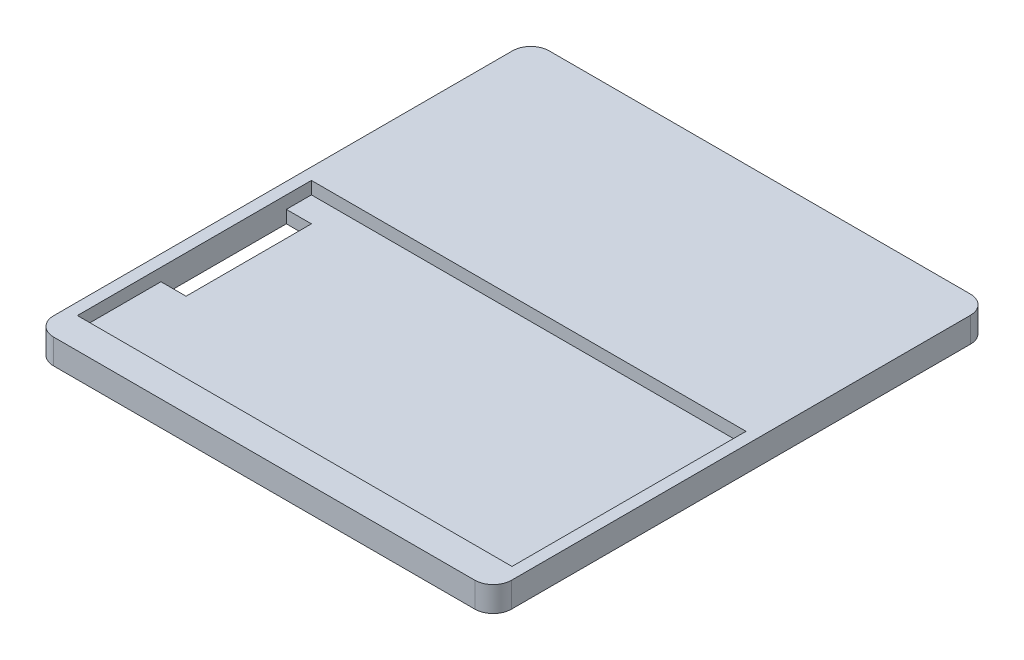
ISO-10303-21;
HEADER;
FILE_DESCRIPTION(('STEP AP214'),'2;1');
FILE_NAME('part.step','',(''),(''),'','','');
FILE_SCHEMA(('AUTOMOTIVE_DESIGN { 1 0 10303 214 1 1 1 1 }'));
ENDSEC;
DATA;
#1=APPLICATION_CONTEXT('core data for automotive mechanical design processes');
#2=APPLICATION_PROTOCOL_DEFINITION('international standard','automotive_design',2000,#1);
#3=PRODUCT_CONTEXT('',#1,'mechanical');
#4=PRODUCT('Part','Part','',(#3));
#5=PRODUCT_RELATED_PRODUCT_CATEGORY('part','',(#4));
#6=PRODUCT_DEFINITION_FORMATION('','',#4);
#7=PRODUCT_DEFINITION_CONTEXT('part definition',#1,'design');
#8=PRODUCT_DEFINITION('design','',#6,#7);
#9=PRODUCT_DEFINITION_SHAPE('','',#8);
#10=(LENGTH_UNIT() NAMED_UNIT(*) SI_UNIT(.MILLI.,.METRE.));
#11=(NAMED_UNIT(*) PLANE_ANGLE_UNIT() SI_UNIT($,.RADIAN.));
#12=(NAMED_UNIT(*) SI_UNIT($,.STERADIAN.) SOLID_ANGLE_UNIT());
#13=UNCERTAINTY_MEASURE_WITH_UNIT(LENGTH_MEASURE(1.E-05),#10,'distance_accuracy_value','');
#14=(GEOMETRIC_REPRESENTATION_CONTEXT(3) GLOBAL_UNCERTAINTY_ASSIGNED_CONTEXT((#13)) GLOBAL_UNIT_ASSIGNED_CONTEXT((#10,
#11,#12)) REPRESENTATION_CONTEXT('',''));
#15=CARTESIAN_POINT('',(0.,0.,0.));
#16=DIRECTION('',(0.,0.,1.));
#17=DIRECTION('',(1.,0.,0.));
#18=AXIS2_PLACEMENT_3D('',#15,#16,#17);
#19=CARTESIAN_POINT('',(0.,3.,0.));
#20=DIRECTION('',(0.,-1.,0.));
#21=DIRECTION('',(0.,0.,-1.));
#22=AXIS2_PLACEMENT_3D('',#19,#20,#21);
#23=PLANE('',#22);
#24=DIRECTION('',(1.,0.,0.));
#25=VECTOR('',#24,1.);
#26=CARTESIAN_POINT('',(-27.4,3.,29.65));
#27=LINE('',#26,#25);
#28=CARTESIAN_POINT('',(-25.2,3.,29.65));
#29=VERTEX_POINT('',#28);
#30=CARTESIAN_POINT('',(25.2,3.,29.65));
#31=VERTEX_POINT('',#30);
#32=EDGE_CURVE('E183',#29,#31,#27,.T.);
#33=ORIENTED_EDGE('',*,*,#32,.T.);
#34=CARTESIAN_POINT('',(25.2,3.,27.45));
#35=DIRECTION('',(0.,-1.,0.));
#36=DIRECTION('',(0.,0.,-1.));
#37=AXIS2_PLACEMENT_3D('',#34,#35,#36);
#38=CIRCLE('',#37,2.2);
#39=CARTESIAN_POINT('',(27.4,3.,27.45));
#40=VERTEX_POINT('',#39);
#41=EDGE_CURVE('E221',#31,#40,#38,.F.);
#42=ORIENTED_EDGE('',*,*,#41,.T.);
#43=DIRECTION('',(0.,0.,-1.));
#44=VECTOR('',#43,1.);
#45=CARTESIAN_POINT('',(27.4,3.,29.65));
#46=LINE('',#45,#44);
#47=CARTESIAN_POINT('',(27.4,3.,-27.45));
#48=VERTEX_POINT('',#47);
#49=EDGE_CURVE('E173',#40,#48,#46,.T.);
#50=ORIENTED_EDGE('',*,*,#49,.T.);
#51=CARTESIAN_POINT('',(25.2,3.,-27.45));
#52=DIRECTION('',(0.,-1.,0.));
#53=DIRECTION('',(0.,0.,-1.));
#54=AXIS2_PLACEMENT_3D('',#51,#52,#53);
#55=CIRCLE('',#54,2.2);
#56=CARTESIAN_POINT('',(25.2,3.,-29.65));
#57=VERTEX_POINT('',#56);
#58=EDGE_CURVE('E215',#48,#57,#55,.F.);
#59=ORIENTED_EDGE('',*,*,#58,.T.);
#60=DIRECTION('',(-1.,0.,0.));
#61=VECTOR('',#60,1.);
#62=CARTESIAN_POINT('',(-27.4,3.,-29.65));
#63=LINE('',#62,#61);
#64=CARTESIAN_POINT('',(-25.2,3.,-29.65));
#65=VERTEX_POINT('',#64);
#66=EDGE_CURVE('E176',#57,#65,#63,.T.);
#67=ORIENTED_EDGE('',*,*,#66,.T.);
#68=CARTESIAN_POINT('',(-25.2,3.,-27.45));
#69=DIRECTION('',(0.,-1.,0.));
#70=DIRECTION('',(0.,0.,-1.));
#71=AXIS2_PLACEMENT_3D('',#68,#69,#70);
#72=CIRCLE('',#71,2.2);
#73=CARTESIAN_POINT('',(-27.4,3.,-27.45));
#74=VERTEX_POINT('',#73);
#75=EDGE_CURVE('E217',#65,#74,#72,.F.);
#76=ORIENTED_EDGE('',*,*,#75,.T.);
#77=DIRECTION('',(0.,0.,1.));
#78=VECTOR('',#77,1.);
#79=CARTESIAN_POINT('',(-27.4,3.,29.65));
#80=LINE('',#79,#78);
#81=CARTESIAN_POINT('',(-27.4,3.,27.45));
#82=VERTEX_POINT('',#81);
#83=EDGE_CURVE('E180',#74,#82,#80,.T.);
#84=ORIENTED_EDGE('',*,*,#83,.T.);
#85=CARTESIAN_POINT('',(-25.2,3.,27.45));
#86=DIRECTION('',(0.,-1.,0.));
#87=DIRECTION('',(0.,0.,-1.));
#88=AXIS2_PLACEMENT_3D('',#85,#86,#87);
#89=CIRCLE('',#88,2.2);
#90=EDGE_CURVE('E219',#82,#29,#89,.F.);
#91=ORIENTED_EDGE('',*,*,#90,.T.);
#92=EDGE_LOOP('',(#33,#42,#50,#59,#67,#76,#84,#91));
#93=FACE_BOUND('',#92,.T.);
#94=DIRECTION('',(0.,0.,-1.));
#95=VECTOR('',#94,1.);
#96=CARTESIAN_POINT('',(-26.,3.,0.));
#97=LINE('',#96,#95);
#98=CARTESIAN_POINT('',(-26.,3.,26.));
#99=VERTEX_POINT('',#98);
#100=CARTESIAN_POINT('',(-26.,3.,-2.));
#101=VERTEX_POINT('',#100);
#102=EDGE_CURVE('E415',#99,#101,#97,.T.);
#103=ORIENTED_EDGE('',*,*,#102,.T.);
#104=DIRECTION('',(1.,0.,0.));
#105=VECTOR('',#104,1.);
#106=CARTESIAN_POINT('',(0.,3.,-2.));
#107=LINE('',#106,#105);
#108=CARTESIAN_POINT('',(26.,3.,-2.));
#109=VERTEX_POINT('',#108);
#110=EDGE_CURVE('E149',#101,#109,#107,.T.);
#111=ORIENTED_EDGE('',*,*,#110,.T.);
#112=DIRECTION('',(0.,0.,-1.));
#113=VECTOR('',#112,1.);
#114=CARTESIAN_POINT('',(26.,3.,0.));
#115=LINE('',#114,#113);
#116=CARTESIAN_POINT('',(26.,3.,26.));
#117=VERTEX_POINT('',#116);
#118=EDGE_CURVE('E402',#117,#109,#115,.T.);
#119=ORIENTED_EDGE('',*,*,#118,.F.);
#120=DIRECTION('',(1.,0.,0.));
#121=VECTOR('',#120,1.);
#122=CARTESIAN_POINT('',(0.,3.,26.));
#123=LINE('',#122,#121);
#124=EDGE_CURVE('E396',#99,#117,#123,.T.);
#125=ORIENTED_EDGE('',*,*,#124,.F.);
#126=EDGE_LOOP('',(#103,#111,#119,#125));
#127=FACE_BOUND('',#126,.T.);
#128=ADVANCED_FACE('F33',(#93,#127),#23,.F.);
#129=CARTESIAN_POINT('',(-23.,0.,0.));
#130=DIRECTION('',(-1.,0.,0.));
#131=DIRECTION('',(0.,0.,1.));
#132=AXIS2_PLACEMENT_3D('',#129,#130,#131);
#133=PLANE('',#132);
#134=DIRECTION('',(0.,1.,0.));
#135=VECTOR('',#134,1.);
#136=CARTESIAN_POINT('',(-23.,0.,16.));
#137=LINE('',#136,#135);
#138=CARTESIAN_POINT('',(-23.,0.,16.));
#139=VERTEX_POINT('',#138);
#140=CARTESIAN_POINT('',(-23.,1.5,16.));
#141=VERTEX_POINT('',#140);
#142=EDGE_CURVE('E158',#139,#141,#137,.T.);
#143=ORIENTED_EDGE('',*,*,#142,.T.);
#144=DIRECTION('',(0.,0.,1.));
#145=VECTOR('',#144,1.);
#146=CARTESIAN_POINT('',(-23.,1.5,0.));
#147=LINE('',#146,#145);
#148=CARTESIAN_POINT('',(-23.,1.5,1.));
#149=VERTEX_POINT('',#148);
#150=EDGE_CURVE('E146',#149,#141,#147,.T.);
#151=ORIENTED_EDGE('',*,*,#150,.F.);
#152=DIRECTION('',(0.,1.,0.));
#153=VECTOR('',#152,1.);
#154=CARTESIAN_POINT('',(-23.,0.,1.));
#155=LINE('',#154,#153);
#156=CARTESIAN_POINT('',(-23.,0.,1.));
#157=VERTEX_POINT('',#156);
#158=EDGE_CURVE('E155',#157,#149,#155,.T.);
#159=ORIENTED_EDGE('',*,*,#158,.F.);
#160=DIRECTION('',(0.,0.,1.));
#161=VECTOR('',#160,1.);
#162=CARTESIAN_POINT('',(-23.,0.,0.));
#163=LINE('',#162,#161);
#164=EDGE_CURVE('E420',#157,#139,#163,.T.);
#165=ORIENTED_EDGE('',*,*,#164,.T.);
#166=EDGE_LOOP('',(#143,#151,#159,#165));
#167=FACE_BOUND('',#166,.T.);
#168=ADVANCED_FACE('F154',(#167),#133,.T.);
#169=CARTESIAN_POINT('',(0.,0.,16.));
#170=DIRECTION('',(0.,0.,1.));
#171=DIRECTION('',(1.,0.,0.));
#172=AXIS2_PLACEMENT_3D('',#169,#170,#171);
#173=PLANE('',#172);
#174=DIRECTION('',(1.,0.,0.));
#175=VECTOR('',#174,1.);
#176=CARTESIAN_POINT('',(0.,1.5,16.));
#177=LINE('',#176,#175);
#178=CARTESIAN_POINT('',(-26.,1.5,16.));
#179=VERTEX_POINT('',#178);
#180=EDGE_CURVE('E159',#179,#141,#177,.T.);
#181=ORIENTED_EDGE('',*,*,#180,.T.);
#182=ORIENTED_EDGE('',*,*,#142,.F.);
#183=DIRECTION('',(1.,0.,0.));
#184=VECTOR('',#183,1.);
#185=CARTESIAN_POINT('',(0.,0.,16.));
#186=LINE('',#185,#184);
#187=CARTESIAN_POINT('',(-26.,0.,16.));
#188=VERTEX_POINT('',#187);
#189=EDGE_CURVE('E164',#188,#139,#186,.T.);
#190=ORIENTED_EDGE('',*,*,#189,.F.);
#191=DIRECTION('',(0.,1.,0.));
#192=VECTOR('',#191,1.);
#193=CARTESIAN_POINT('',(-26.,0.,16.));
#194=LINE('',#193,#192);
#195=EDGE_CURVE('E166',#188,#179,#194,.T.);
#196=ORIENTED_EDGE('',*,*,#195,.T.);
#197=EDGE_LOOP('',(#181,#182,#190,#196));
#198=FACE_BOUND('',#197,.T.);
#199=ADVANCED_FACE('F282',(#198),#173,.F.);
#200=CARTESIAN_POINT('',(0.,0.,1.));
#201=DIRECTION('',(0.,0.,1.));
#202=DIRECTION('',(1.,0.,0.));
#203=AXIS2_PLACEMENT_3D('',#200,#201,#202);
#204=PLANE('',#203);
#205=ORIENTED_EDGE('',*,*,#158,.T.);
#206=DIRECTION('',(1.,0.,0.));
#207=VECTOR('',#206,1.);
#208=CARTESIAN_POINT('',(0.,1.5,1.));
#209=LINE('',#208,#207);
#210=CARTESIAN_POINT('',(-26.,1.5,1.));
#211=VERTEX_POINT('',#210);
#212=EDGE_CURVE('E142',#211,#149,#209,.T.);
#213=ORIENTED_EDGE('',*,*,#212,.F.);
#214=DIRECTION('',(0.,1.,0.));
#215=VECTOR('',#214,1.);
#216=CARTESIAN_POINT('',(-26.,0.,1.));
#217=LINE('',#216,#215);
#218=CARTESIAN_POINT('',(-26.,0.,1.));
#219=VERTEX_POINT('',#218);
#220=EDGE_CURVE('E55',#219,#211,#217,.T.);
#221=ORIENTED_EDGE('',*,*,#220,.F.);
#222=DIRECTION('',(1.,0.,0.));
#223=VECTOR('',#222,1.);
#224=CARTESIAN_POINT('',(0.,0.,1.));
#225=LINE('',#224,#223);
#226=EDGE_CURVE('E163',#219,#157,#225,.T.);
#227=ORIENTED_EDGE('',*,*,#226,.T.);
#228=EDGE_LOOP('',(#205,#213,#221,#227));
#229=FACE_BOUND('',#228,.T.);
#230=ADVANCED_FACE('F161',(#229),#204,.T.);
#231=CARTESIAN_POINT('',(0.,0.,0.));
#232=DIRECTION('',(0.,-1.,0.));
#233=DIRECTION('',(0.,0.,-1.));
#234=AXIS2_PLACEMENT_3D('',#231,#232,#233);
#235=PLANE('',#234);
#236=DIRECTION('',(0.,0.,-1.));
#237=VECTOR('',#236,1.);
#238=CARTESIAN_POINT('',(27.4,0.,29.65));
#239=LINE('',#238,#237);
#240=CARTESIAN_POINT('',(27.4,0.,27.45));
#241=VERTEX_POINT('',#240);
#242=CARTESIAN_POINT('',(27.4,0.,-27.45));
#243=VERTEX_POINT('',#242);
#244=EDGE_CURVE('E187',#241,#243,#239,.T.);
#245=ORIENTED_EDGE('',*,*,#244,.F.);
#246=CARTESIAN_POINT('',(25.2,0.,27.45));
#247=DIRECTION('',(0.,-1.,0.));
#248=DIRECTION('',(0.,0.,-1.));
#249=AXIS2_PLACEMENT_3D('',#246,#247,#248);
#250=CIRCLE('',#249,2.2);
#251=CARTESIAN_POINT('',(25.2,0.,29.65));
#252=VERTEX_POINT('',#251);
#253=EDGE_CURVE('E208',#241,#252,#250,.T.);
#254=ORIENTED_EDGE('',*,*,#253,.T.);
#255=DIRECTION('',(1.,0.,0.));
#256=VECTOR('',#255,1.);
#257=CARTESIAN_POINT('',(-27.4,0.,29.65));
#258=LINE('',#257,#256);
#259=CARTESIAN_POINT('',(-25.2,0.,29.65));
#260=VERTEX_POINT('',#259);
#261=EDGE_CURVE('E177',#260,#252,#258,.T.);
#262=ORIENTED_EDGE('',*,*,#261,.F.);
#263=CARTESIAN_POINT('',(-25.2,0.,27.45));
#264=DIRECTION('',(0.,-1.,0.));
#265=DIRECTION('',(0.,0.,-1.));
#266=AXIS2_PLACEMENT_3D('',#263,#264,#265);
#267=CIRCLE('',#266,2.2);
#268=CARTESIAN_POINT('',(-27.4,0.,27.45));
#269=VERTEX_POINT('',#268);
#270=EDGE_CURVE('E206',#260,#269,#267,.T.);
#271=ORIENTED_EDGE('',*,*,#270,.T.);
#272=DIRECTION('',(0.,0.,1.));
#273=VECTOR('',#272,1.);
#274=CARTESIAN_POINT('',(-27.4,0.,29.65));
#275=LINE('',#274,#273);
#276=CARTESIAN_POINT('',(-27.4,0.,-27.45));
#277=VERTEX_POINT('',#276);
#278=EDGE_CURVE('E193',#277,#269,#275,.T.);
#279=ORIENTED_EDGE('',*,*,#278,.F.);
#280=CARTESIAN_POINT('',(-25.2,0.,-27.45));
#281=DIRECTION('',(0.,-1.,0.));
#282=DIRECTION('',(0.,0.,-1.));
#283=AXIS2_PLACEMENT_3D('',#280,#281,#282);
#284=CIRCLE('',#283,2.2);
#285=CARTESIAN_POINT('',(-25.2,0.,-29.65));
#286=VERTEX_POINT('',#285);
#287=EDGE_CURVE('E204',#277,#286,#284,.T.);
#288=ORIENTED_EDGE('',*,*,#287,.T.);
#289=DIRECTION('',(-1.,0.,0.));
#290=VECTOR('',#289,1.);
#291=CARTESIAN_POINT('',(-27.4,0.,-29.65));
#292=LINE('',#291,#290);
#293=CARTESIAN_POINT('',(25.2,0.,-29.65));
#294=VERTEX_POINT('',#293);
#295=EDGE_CURVE('E190',#294,#286,#292,.T.);
#296=ORIENTED_EDGE('',*,*,#295,.F.);
#297=CARTESIAN_POINT('',(25.2,0.,-27.45));
#298=DIRECTION('',(0.,-1.,0.));
#299=DIRECTION('',(0.,0.,-1.));
#300=AXIS2_PLACEMENT_3D('',#297,#298,#299);
#301=CIRCLE('',#300,2.2);
#302=EDGE_CURVE('E202',#294,#243,#301,.T.);
#303=ORIENTED_EDGE('',*,*,#302,.T.);
#304=EDGE_LOOP('',(#245,#254,#262,#271,#279,#288,#296,#303));
#305=FACE_BOUND('',#304,.T.);
#306=ORIENTED_EDGE('',*,*,#189,.T.);
#307=ORIENTED_EDGE('',*,*,#164,.F.);
#308=ORIENTED_EDGE('',*,*,#226,.F.);
#309=DIRECTION('',(0.,0.,-1.));
#310=VECTOR('',#309,1.);
#311=CARTESIAN_POINT('',(-26.,0.,0.));
#312=LINE('',#311,#310);
#313=EDGE_CURVE('E169',#188,#219,#312,.T.);
#314=ORIENTED_EDGE('',*,*,#313,.F.);
#315=EDGE_LOOP('',(#306,#307,#308,#314));
#316=FACE_BOUND('',#315,.T.);
#317=ADVANCED_FACE('F238',(#305,#316),#235,.T.);
#318=CARTESIAN_POINT('',(27.4,3.,29.65));
#319=DIRECTION('',(-1.,0.,0.));
#320=DIRECTION('',(0.,0.,1.));
#321=AXIS2_PLACEMENT_3D('',#318,#319,#320);
#322=PLANE('',#321);
#323=ORIENTED_EDGE('',*,*,#49,.F.);
#324=DIRECTION('',(0.,-1.,0.));
#325=VECTOR('',#324,1.);
#326=CARTESIAN_POINT('',(27.4,3.,27.45));
#327=LINE('',#326,#325);
#328=EDGE_CURVE('E199',#40,#241,#327,.T.);
#329=ORIENTED_EDGE('',*,*,#328,.T.);
#330=ORIENTED_EDGE('',*,*,#244,.T.);
#331=DIRECTION('',(0.,-1.,0.));
#332=VECTOR('',#331,1.);
#333=CARTESIAN_POINT('',(27.4,3.,-27.45));
#334=LINE('',#333,#332);
#335=EDGE_CURVE('E186',#243,#48,#334,.F.);
#336=ORIENTED_EDGE('',*,*,#335,.T.);
#337=EDGE_LOOP('',(#323,#329,#330,#336));
#338=FACE_BOUND('',#337,.T.);
#339=ADVANCED_FACE('F266',(#338),#322,.F.);
#340=CARTESIAN_POINT('',(-27.4,3.,-29.65));
#341=DIRECTION('',(0.,0.,1.));
#342=DIRECTION('',(1.,0.,0.));
#343=AXIS2_PLACEMENT_3D('',#340,#341,#342);
#344=PLANE('',#343);
#345=ORIENTED_EDGE('',*,*,#295,.T.);
#346=DIRECTION('',(0.,-1.,0.));
#347=VECTOR('',#346,1.);
#348=CARTESIAN_POINT('',(-25.2,3.,-29.65));
#349=LINE('',#348,#347);
#350=EDGE_CURVE('E11',#286,#65,#349,.F.);
#351=ORIENTED_EDGE('',*,*,#350,.T.);
#352=ORIENTED_EDGE('',*,*,#66,.F.);
#353=DIRECTION('',(0.,-1.,0.));
#354=VECTOR('',#353,1.);
#355=CARTESIAN_POINT('',(25.2,3.,-29.65));
#356=LINE('',#355,#354);
#357=EDGE_CURVE('E41',#57,#294,#356,.T.);
#358=ORIENTED_EDGE('',*,*,#357,.T.);
#359=EDGE_LOOP('',(#345,#351,#352,#358));
#360=FACE_BOUND('',#359,.T.);
#361=ADVANCED_FACE('F232',(#360),#344,.F.);
#362=CARTESIAN_POINT('',(-27.4,3.,29.65));
#363=DIRECTION('',(1.,0.,0.));
#364=DIRECTION('',(0.,0.,-1.));
#365=AXIS2_PLACEMENT_3D('',#362,#363,#364);
#366=PLANE('',#365);
#367=ORIENTED_EDGE('',*,*,#278,.T.);
#368=DIRECTION('',(0.,-1.,0.));
#369=VECTOR('',#368,1.);
#370=CARTESIAN_POINT('',(-27.4,3.,27.45));
#371=LINE('',#370,#369);
#372=EDGE_CURVE('E226',#269,#82,#371,.F.);
#373=ORIENTED_EDGE('',*,*,#372,.T.);
#374=ORIENTED_EDGE('',*,*,#83,.F.);
#375=DIRECTION('',(0.,-1.,0.));
#376=VECTOR('',#375,1.);
#377=CARTESIAN_POINT('',(-27.4,3.,-27.45));
#378=LINE('',#377,#376);
#379=EDGE_CURVE('E223',#74,#277,#378,.T.);
#380=ORIENTED_EDGE('',*,*,#379,.T.);
#381=EDGE_LOOP('',(#367,#373,#374,#380));
#382=FACE_BOUND('',#381,.T.);
#383=ADVANCED_FACE('F247',(#382),#366,.F.);
#384=CARTESIAN_POINT('',(-27.4,3.,29.65));
#385=DIRECTION('',(0.,0.,-1.));
#386=DIRECTION('',(-1.,0.,0.));
#387=AXIS2_PLACEMENT_3D('',#384,#385,#386);
#388=PLANE('',#387);
#389=ORIENTED_EDGE('',*,*,#261,.T.);
#390=DIRECTION('',(0.,-1.,0.));
#391=VECTOR('',#390,1.);
#392=CARTESIAN_POINT('',(25.2,3.,29.65));
#393=LINE('',#392,#391);
#394=EDGE_CURVE('E213',#252,#31,#393,.F.);
#395=ORIENTED_EDGE('',*,*,#394,.T.);
#396=ORIENTED_EDGE('',*,*,#32,.F.);
#397=DIRECTION('',(0.,-1.,0.));
#398=VECTOR('',#397,1.);
#399=CARTESIAN_POINT('',(-25.2,3.,29.65));
#400=LINE('',#399,#398);
#401=EDGE_CURVE('E210',#29,#260,#400,.T.);
#402=ORIENTED_EDGE('',*,*,#401,.T.);
#403=EDGE_LOOP('',(#389,#395,#396,#402));
#404=FACE_BOUND('',#403,.T.);
#405=ADVANCED_FACE('F258',(#404),#388,.F.);
#406=CARTESIAN_POINT('',(25.2,3.,27.45));
#407=DIRECTION('',(0.,-1.,0.));
#408=DIRECTION('',(0.,0.,-1.));
#409=AXIS2_PLACEMENT_3D('',#406,#407,#408);
#410=CYLINDRICAL_SURFACE('',#409,2.2);
#411=ORIENTED_EDGE('',*,*,#41,.F.);
#412=ORIENTED_EDGE('',*,*,#394,.F.);
#413=ORIENTED_EDGE('',*,*,#253,.F.);
#414=ORIENTED_EDGE('',*,*,#328,.F.);
#415=EDGE_LOOP('',(#411,#412,#413,#414));
#416=FACE_BOUND('',#415,.T.);
#417=ADVANCED_FACE('F263',(#416),#410,.T.);
#418=CARTESIAN_POINT('',(-25.2,3.,27.45));
#419=DIRECTION('',(0.,-1.,0.));
#420=DIRECTION('',(0.,0.,-1.));
#421=AXIS2_PLACEMENT_3D('',#418,#419,#420);
#422=CYLINDRICAL_SURFACE('',#421,2.2);
#423=ORIENTED_EDGE('',*,*,#90,.F.);
#424=ORIENTED_EDGE('',*,*,#372,.F.);
#425=ORIENTED_EDGE('',*,*,#270,.F.);
#426=ORIENTED_EDGE('',*,*,#401,.F.);
#427=EDGE_LOOP('',(#423,#424,#425,#426));
#428=FACE_BOUND('',#427,.T.);
#429=ADVANCED_FACE('F255',(#428),#422,.T.);
#430=CARTESIAN_POINT('',(-25.2,3.,-27.45));
#431=DIRECTION('',(0.,-1.,0.));
#432=DIRECTION('',(0.,0.,-1.));
#433=AXIS2_PLACEMENT_3D('',#430,#431,#432);
#434=CYLINDRICAL_SURFACE('',#433,2.2);
#435=ORIENTED_EDGE('',*,*,#75,.F.);
#436=ORIENTED_EDGE('',*,*,#350,.F.);
#437=ORIENTED_EDGE('',*,*,#287,.F.);
#438=ORIENTED_EDGE('',*,*,#379,.F.);
#439=EDGE_LOOP('',(#435,#436,#437,#438));
#440=FACE_BOUND('',#439,.T.);
#441=ADVANCED_FACE('F244',(#440),#434,.T.);
#442=CARTESIAN_POINT('',(25.2,3.,-27.45));
#443=DIRECTION('',(0.,-1.,0.));
#444=DIRECTION('',(0.,0.,-1.));
#445=AXIS2_PLACEMENT_3D('',#442,#443,#444);
#446=CYLINDRICAL_SURFACE('',#445,2.2);
#447=ORIENTED_EDGE('',*,*,#58,.F.);
#448=ORIENTED_EDGE('',*,*,#335,.F.);
#449=ORIENTED_EDGE('',*,*,#302,.F.);
#450=ORIENTED_EDGE('',*,*,#357,.F.);
#451=EDGE_LOOP('',(#447,#448,#449,#450));
#452=FACE_BOUND('',#451,.T.);
#453=ADVANCED_FACE('F35',(#452),#446,.T.);
#454=CARTESIAN_POINT('',(-26.,0.,0.));
#455=DIRECTION('',(1.,0.,0.));
#456=DIRECTION('',(0.,0.,-1.));
#457=AXIS2_PLACEMENT_3D('',#454,#455,#456);
#458=PLANE('',#457);
#459=ORIENTED_EDGE('',*,*,#102,.F.);
#460=DIRECTION('',(0.,1.,0.));
#461=VECTOR('',#460,1.);
#462=CARTESIAN_POINT('',(-26.,1.5,26.));
#463=LINE('',#462,#461);
#464=CARTESIAN_POINT('',(-26.,1.5,26.));
#465=VERTEX_POINT('',#464);
#466=EDGE_CURVE('E401',#465,#99,#463,.T.);
#467=ORIENTED_EDGE('',*,*,#466,.F.);
#468=DIRECTION('',(0.,0.,-1.));
#469=VECTOR('',#468,1.);
#470=CARTESIAN_POINT('',(-26.,1.5,0.));
#471=LINE('',#470,#469);
#472=EDGE_CURVE('E429',#465,#179,#471,.T.);
#473=ORIENTED_EDGE('',*,*,#472,.T.);
#474=ORIENTED_EDGE('',*,*,#195,.F.);
#475=ORIENTED_EDGE('',*,*,#313,.T.);
#476=ORIENTED_EDGE('',*,*,#220,.T.);
#477=CARTESIAN_POINT('',(-26.,1.5,-2.));
#478=VERTEX_POINT('',#477);
#479=EDGE_CURVE('E48',#211,#478,#471,.T.);
#480=ORIENTED_EDGE('',*,*,#479,.T.);
#481=DIRECTION('',(0.,1.,0.));
#482=VECTOR('',#481,1.);
#483=CARTESIAN_POINT('',(-26.,1.5,-2.));
#484=LINE('',#483,#482);
#485=EDGE_CURVE('E412',#478,#101,#484,.T.);
#486=ORIENTED_EDGE('',*,*,#485,.T.);
#487=EDGE_LOOP('',(#459,#467,#473,#474,#475,#476,#480,#486));
#488=FACE_BOUND('',#487,.T.);
#489=ADVANCED_FACE('F269',(#488),#458,.T.);
#490=CARTESIAN_POINT('',(0.,1.5,-2.));
#491=DIRECTION('',(0.,0.,1.));
#492=DIRECTION('',(1.,0.,0.));
#493=AXIS2_PLACEMENT_3D('',#490,#491,#492);
#494=PLANE('',#493);
#495=ORIENTED_EDGE('',*,*,#110,.F.);
#496=ORIENTED_EDGE('',*,*,#485,.F.);
#497=DIRECTION('',(1.,0.,0.));
#498=VECTOR('',#497,1.);
#499=CARTESIAN_POINT('',(0.,1.5,-2.));
#500=LINE('',#499,#498);
#501=CARTESIAN_POINT('',(26.,1.5,-2.));
#502=VERTEX_POINT('',#501);
#503=EDGE_CURVE('E438',#478,#502,#500,.T.);
#504=ORIENTED_EDGE('',*,*,#503,.T.);
#505=DIRECTION('',(0.,1.,0.));
#506=VECTOR('',#505,1.);
#507=CARTESIAN_POINT('',(26.,1.5,-2.));
#508=LINE('',#507,#506);
#509=EDGE_CURVE('E416',#502,#109,#508,.T.);
#510=ORIENTED_EDGE('',*,*,#509,.T.);
#511=EDGE_LOOP('',(#495,#496,#504,#510));
#512=FACE_BOUND('',#511,.T.);
#513=ADVANCED_FACE('F274',(#512),#494,.T.);
#514=CARTESIAN_POINT('',(26.,1.5,0.));
#515=DIRECTION('',(1.,0.,0.));
#516=DIRECTION('',(0.,0.,-1.));
#517=AXIS2_PLACEMENT_3D('',#514,#515,#516);
#518=PLANE('',#517);
#519=ORIENTED_EDGE('',*,*,#118,.T.);
#520=ORIENTED_EDGE('',*,*,#509,.F.);
#521=DIRECTION('',(0.,0.,-1.));
#522=VECTOR('',#521,1.);
#523=CARTESIAN_POINT('',(26.,1.5,0.));
#524=LINE('',#523,#522);
#525=CARTESIAN_POINT('',(26.,1.5,26.));
#526=VERTEX_POINT('',#525);
#527=EDGE_CURVE('E436',#526,#502,#524,.T.);
#528=ORIENTED_EDGE('',*,*,#527,.F.);
#529=DIRECTION('',(0.,1.,0.));
#530=VECTOR('',#529,1.);
#531=CARTESIAN_POINT('',(26.,1.5,26.));
#532=LINE('',#531,#530);
#533=EDGE_CURVE('E399',#526,#117,#532,.T.);
#534=ORIENTED_EDGE('',*,*,#533,.T.);
#535=EDGE_LOOP('',(#519,#520,#528,#534));
#536=FACE_BOUND('',#535,.T.);
#537=ADVANCED_FACE('F361',(#536),#518,.F.);
#538=CARTESIAN_POINT('',(0.,1.5,26.));
#539=DIRECTION('',(0.,0.,1.));
#540=DIRECTION('',(1.,0.,0.));
#541=AXIS2_PLACEMENT_3D('',#538,#539,#540);
#542=PLANE('',#541);
#543=ORIENTED_EDGE('',*,*,#124,.T.);
#544=ORIENTED_EDGE('',*,*,#533,.F.);
#545=DIRECTION('',(1.,0.,0.));
#546=VECTOR('',#545,1.);
#547=CARTESIAN_POINT('',(0.,1.5,26.));
#548=LINE('',#547,#546);
#549=EDGE_CURVE('E431',#465,#526,#548,.T.);
#550=ORIENTED_EDGE('',*,*,#549,.F.);
#551=ORIENTED_EDGE('',*,*,#466,.T.);
#552=EDGE_LOOP('',(#543,#544,#550,#551));
#553=FACE_BOUND('',#552,.T.);
#554=ADVANCED_FACE('F371',(#553),#542,.F.);
#555=CARTESIAN_POINT('',(0.,1.5,0.));
#556=DIRECTION('',(0.,1.,0.));
#557=DIRECTION('',(0.,0.,1.));
#558=AXIS2_PLACEMENT_3D('',#555,#556,#557);
#559=PLANE('',#558);
#560=ORIENTED_EDGE('',*,*,#212,.T.);
#561=ORIENTED_EDGE('',*,*,#150,.T.);
#562=ORIENTED_EDGE('',*,*,#180,.F.);
#563=ORIENTED_EDGE('',*,*,#472,.F.);
#564=ORIENTED_EDGE('',*,*,#549,.T.);
#565=ORIENTED_EDGE('',*,*,#527,.T.);
#566=ORIENTED_EDGE('',*,*,#503,.F.);
#567=ORIENTED_EDGE('',*,*,#479,.F.);
#568=EDGE_LOOP('',(#560,#561,#562,#563,#564,#565,#566,#567));
#569=FACE_BOUND('',#568,.T.);
#570=ADVANCED_FACE('F144',(#569),#559,.T.);
#571=CLOSED_SHELL('',(#128,#168,#199,#230,#317,#339,#361,#383,#405,#417,#429,#441,#453,#489,
#513,#537,#554,#570));
#572=MANIFOLD_SOLID_BREP('B2',#571);
#573=ADVANCED_BREP_SHAPE_REPRESENTATION('',(#18,#572),#14);
#574=SHAPE_DEFINITION_REPRESENTATION(#9,#573);
ENDSEC;
END-ISO-10303-21;
